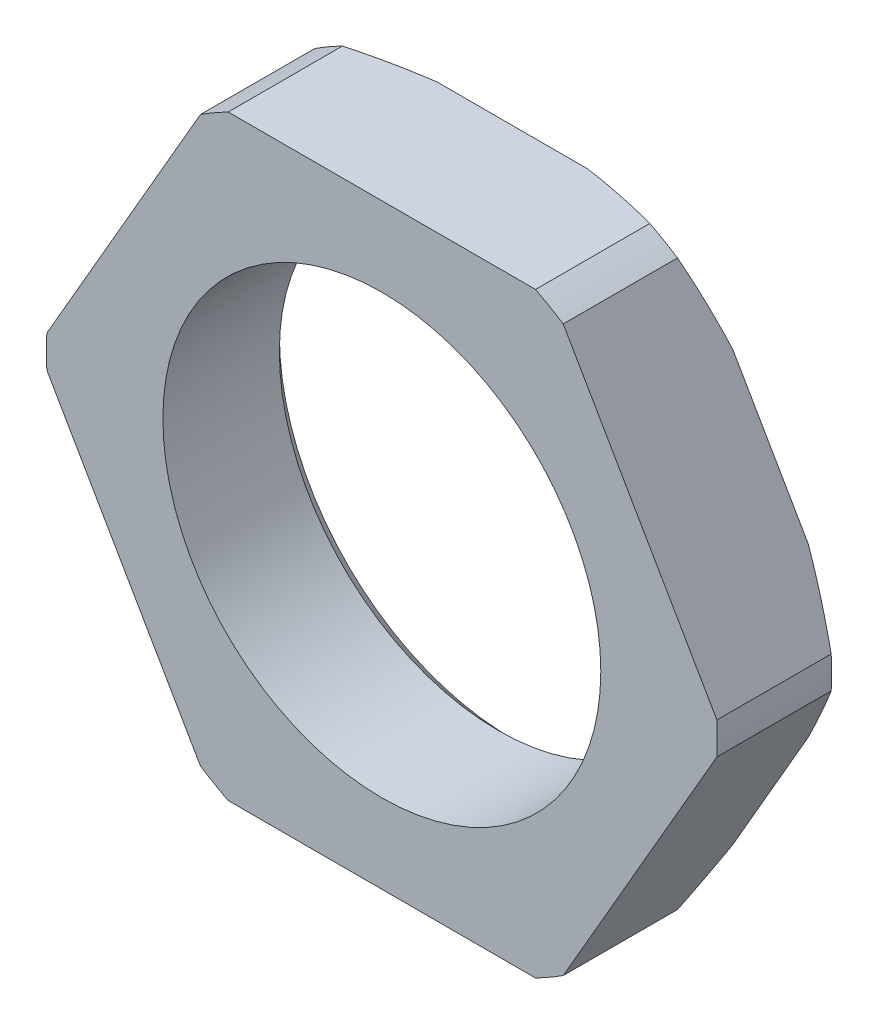
ISO-10303-21;
HEADER;
FILE_DESCRIPTION(('STEP AP214'),'2;1');
FILE_NAME('part.step','',(''),(''),'','','');
FILE_SCHEMA(('AUTOMOTIVE_DESIGN { 1 0 10303 214 1 1 1 1 }'));
ENDSEC;
DATA;
#1=APPLICATION_CONTEXT('core data for automotive mechanical design processes');
#2=APPLICATION_PROTOCOL_DEFINITION('international standard','automotive_design',2000,#1);
#3=PRODUCT_CONTEXT('',#1,'mechanical');
#4=PRODUCT('Part','Part','',(#3));
#5=PRODUCT_RELATED_PRODUCT_CATEGORY('part','',(#4));
#6=PRODUCT_DEFINITION_FORMATION('','',#4);
#7=PRODUCT_DEFINITION_CONTEXT('part definition',#1,'design');
#8=PRODUCT_DEFINITION('design','',#6,#7);
#9=PRODUCT_DEFINITION_SHAPE('','',#8);
#10=(LENGTH_UNIT() NAMED_UNIT(*) SI_UNIT(.MILLI.,.METRE.));
#11=(NAMED_UNIT(*) PLANE_ANGLE_UNIT() SI_UNIT($,.RADIAN.));
#12=(NAMED_UNIT(*) SI_UNIT($,.STERADIAN.) SOLID_ANGLE_UNIT());
#13=UNCERTAINTY_MEASURE_WITH_UNIT(LENGTH_MEASURE(1.E-05),#10,'distance_accuracy_value','');
#14=(GEOMETRIC_REPRESENTATION_CONTEXT(3) GLOBAL_UNCERTAINTY_ASSIGNED_CONTEXT((#13)) GLOBAL_UNIT_ASSIGNED_CONTEXT((#10,
#11,#12)) REPRESENTATION_CONTEXT('',''));
#15=CARTESIAN_POINT('',(0.,0.,0.));
#16=DIRECTION('',(0.,0.,1.));
#17=DIRECTION('',(1.,0.,0.));
#18=AXIS2_PLACEMENT_3D('',#15,#16,#17);
#19=CARTESIAN_POINT('',(0.,0.,-14.6633589102944));
#20=DIRECTION('',(0.,0.,1.));
#21=DIRECTION('',(1.,0.,0.));
#22=AXIS2_PLACEMENT_3D('',#19,#20,#21);
#23=CONICAL_SURFACE('',#22,18.,1.0471975511966);
#24=CARTESIAN_POINT('',(-4.03112887414931,-16.,-15.5293843140788));
#25=CARTESIAN_POINT('',(-4.3866132941997,-16.,-15.4792566705536));
#26=CARTESIAN_POINT('',(-4.74120174997239,-16.,-15.4229891250638));
#27=CARTESIAN_POINT('',(-5.44808349155829,-16.,-15.2991529721685));
#28=CARTESIAN_POINT('',(-5.80037851979249,-16.,-15.2315943346179));
#29=CARTESIAN_POINT('',(-6.50275542385974,-16.,-15.0860716925836));
#30=CARTESIAN_POINT('',(-6.85283754660872,-16.,-15.0081088712569));
#31=CARTESIAN_POINT('',(-7.55106969836229,-16.,-14.8426449075461));
#32=CARTESIAN_POINT('',(-7.89921775816723,-16.,-14.7551354397336));
#33=CARTESIAN_POINT('',(-8.24621125123532,-16.,-14.6633589102944));
#34=B_SPLINE_CURVE_WITH_KNOTS('',3,(#24,#25,#26,#27,#28,#29,#30,#31,#32,#33),.UNSPECIFIED.,.F.,
.F.,(4,2,2,2,4),(0.,1.07690776762645,2.15286961850029,3.22870921580364,4.30549464564187),.UNSPECIFIED.);
#35=CARTESIAN_POINT('',(-4.03112887414928,-16.,-15.5293843140788));
#36=VERTEX_POINT('',#35);
#37=CARTESIAN_POINT('',(-8.24621125123532,-16.,-14.6633589102944));
#38=VERTEX_POINT('',#37);
#39=EDGE_CURVE('E242',#36,#38,#34,.T.);
#40=ORIENTED_EDGE('',*,*,#39,.T.);
#41=CARTESIAN_POINT('',(0.,0.,-14.6633589102944));
#42=DIRECTION('',(0.,0.,-1.));
#43=DIRECTION('',(-1.,0.,0.));
#44=AXIS2_PLACEMENT_3D('',#41,#42,#43);
#45=CIRCLE('',#44,18.);
#46=CARTESIAN_POINT('',(-9.73330083493334,-15.1414284285429,-14.6633589102944));
#47=VERTEX_POINT('',#46);
#48=EDGE_CURVE('E280',#47,#38,#45,.F.);
#49=ORIENTED_EDGE('',*,*,#48,.F.);
#50=CARTESIAN_POINT('',(-9.73330083493334,-15.1414284285429,-14.6633589102944));
#51=CARTESIAN_POINT('',(-9.90679758146739,-14.840923248598,-14.7551354397336));
#52=CARTESIAN_POINT('',(-10.0808716113699,-14.5394181845286,-14.8426449075461));
#53=CARTESIAN_POINT('',(-10.4299876872466,-13.934731403371,-15.0081088712569));
#54=CARTESIAN_POINT('',(-10.6050287486211,-13.6315513916596,-15.0860716925836));
#55=CARTESIAN_POINT('',(-10.9562172006548,-13.0232751497059,-15.2315943346179));
#56=CARTESIAN_POINT('',(-11.1323647147719,-12.7181787056281,-15.2991529721685));
#57=CARTESIAN_POINT('',(-11.4858055855648,-12.1060011599433,-15.4229891250638));
#58=CARTESIAN_POINT('',(-11.6630998134512,-11.7989185493555,-15.4792566705536));
#59=CARTESIAN_POINT('',(-11.8408420234764,-11.4910600109423,-15.5293843140788));
#60=B_SPLINE_CURVE_WITH_KNOTS('',3,(#50,#51,#52,#53,#54,#55,#56,#57,#58,#59),.UNSPECIFIED.,.F.,
.F.,(4,2,2,2,4),(0.,1.07678542983824,2.15262502714159,3.22858687801544,4.30549464564189),.UNSPECIFIED.);
#61=CARTESIAN_POINT('',(-11.8408420234764,-11.4910600109423,-15.5293843140788));
#62=VERTEX_POINT('',#61);
#63=EDGE_CURVE('E212',#47,#62,#60,.T.);
#64=ORIENTED_EDGE('',*,*,#63,.T.);
#65=CARTESIAN_POINT('',(0.,0.,-15.5293843140788));
#66=DIRECTION('',(0.,0.,1.));
#67=DIRECTION('',(1.,0.,0.));
#68=AXIS2_PLACEMENT_3D('',#65,#66,#67);
#69=CIRCLE('',#68,16.5);
#70=EDGE_CURVE('E349',#62,#36,#69,.T.);
#71=ORIENTED_EDGE('',*,*,#70,.T.);
#72=EDGE_LOOP('',(#40,#49,#64,#71));
#73=FACE_BOUND('',#72,.T.);
#74=ADVANCED_FACE('F16',(#73),#23,.T.);
#75=CARTESIAN_POINT('',(0.,0.,-15.5293843140788));
#76=DIRECTION('',(0.,0.,-1.));
#77=DIRECTION('',(-1.,0.,0.));
#78=AXIS2_PLACEMENT_3D('',#75,#76,#77);
#79=CYLINDRICAL_SURFACE('',#78,18.);
#80=CARTESIAN_POINT('',(0.,0.,-8.52938431407882));
#81=DIRECTION('',(0.,0.,-1.));
#82=DIRECTION('',(-1.,0.,0.));
#83=AXIS2_PLACEMENT_3D('',#80,#81,#82);
#84=CIRCLE('',#83,18.);
#85=CARTESIAN_POINT('',(-8.24621125123532,-16.,-8.52938431407882));
#86=VERTEX_POINT('',#85);
#87=CARTESIAN_POINT('',(-9.73330083493334,-15.1414284285429,-8.52938431407882));
#88=VERTEX_POINT('',#87);
#89=EDGE_CURVE('E20',#86,#88,#84,.T.);
#90=ORIENTED_EDGE('',*,*,#89,.T.);
#91=DIRECTION('',(0.,0.,1.));
#92=VECTOR('',#91,1.);
#93=CARTESIAN_POINT('',(-9.73330083493334,-15.1414284285429,-15.5293843140788));
#94=LINE('',#93,#92);
#95=EDGE_CURVE('E259',#88,#47,#94,.F.);
#96=ORIENTED_EDGE('',*,*,#95,.T.);
#97=ORIENTED_EDGE('',*,*,#48,.T.);
#98=DIRECTION('',(0.,0.,1.));
#99=VECTOR('',#98,1.);
#100=CARTESIAN_POINT('',(-8.24621125123532,-16.,-15.5293843140788));
#101=LINE('',#100,#99);
#102=EDGE_CURVE('E247',#38,#86,#101,.T.);
#103=ORIENTED_EDGE('',*,*,#102,.T.);
#104=EDGE_LOOP('',(#90,#96,#97,#103));
#105=FACE_BOUND('',#104,.T.);
#106=ADVANCED_FACE('F282',(#105),#79,.T.);
#107=CARTESIAN_POINT('',(0.,0.,-14.6633589102944));
#108=DIRECTION('',(0.,0.,1.));
#109=DIRECTION('',(1.,0.,0.));
#110=AXIS2_PLACEMENT_3D('',#107,#108,#109);
#111=CONICAL_SURFACE('',#110,18.,1.0471975511966);
#112=CARTESIAN_POINT('',(11.8408420234764,-11.4910600109423,-15.5293843140788));
#113=CARTESIAN_POINT('',(11.6630998134512,-11.7989185493555,-15.4792566705536));
#114=CARTESIAN_POINT('',(11.4858055855648,-12.1060011599433,-15.4229891250638));
#115=CARTESIAN_POINT('',(11.1323647147719,-12.7181787056281,-15.2991529721685));
#116=CARTESIAN_POINT('',(10.9562172006548,-13.0232751497059,-15.2315943346179));
#117=CARTESIAN_POINT('',(10.6050287486211,-13.6315513916596,-15.0860716925836));
#118=CARTESIAN_POINT('',(10.4299876872466,-13.934731403371,-15.0081088712569));
#119=CARTESIAN_POINT('',(10.0808716113699,-14.5394181845287,-14.8426449075461));
#120=CARTESIAN_POINT('',(9.90679758146739,-14.840923248598,-14.7551354397336));
#121=CARTESIAN_POINT('',(9.73330083493334,-15.1414284285429,-14.6633589102944));
#122=B_SPLINE_CURVE_WITH_KNOTS('',3,(#112,#113,#114,#115,#116,#117,#118,#119,#120,#121),
.UNSPECIFIED.,.F.,.F.,(4,2,2,2,4),(0.,1.07690776762645,2.15286961850029,3.22870921580365,
4.30549464564188),.UNSPECIFIED.);
#123=CARTESIAN_POINT('',(11.8408420234764,-11.4910600109423,-15.5293843140788));
#124=VERTEX_POINT('',#123);
#125=CARTESIAN_POINT('',(9.73330083493334,-15.1414284285429,-14.6633589102944));
#126=VERTEX_POINT('',#125);
#127=EDGE_CURVE('E328',#124,#126,#122,.T.);
#128=ORIENTED_EDGE('',*,*,#127,.T.);
#129=CARTESIAN_POINT('',(0.,0.,-14.6633589102944));
#130=DIRECTION('',(0.,0.,-1.));
#131=DIRECTION('',(-1.,0.,0.));
#132=AXIS2_PLACEMENT_3D('',#129,#130,#131);
#133=CIRCLE('',#132,18.);
#134=CARTESIAN_POINT('',(8.24621125123532,-16.,-14.6633589102944));
#135=VERTEX_POINT('',#134);
#136=EDGE_CURVE('E278',#135,#126,#133,.F.);
#137=ORIENTED_EDGE('',*,*,#136,.F.);
#138=CARTESIAN_POINT('',(8.24621125123532,-16.,-14.6633589102944));
#139=CARTESIAN_POINT('',(7.89921775816722,-16.,-14.7551354397336));
#140=CARTESIAN_POINT('',(7.55106969836229,-16.,-14.8426449075461));
#141=CARTESIAN_POINT('',(6.85283754660871,-16.,-15.0081088712569));
#142=CARTESIAN_POINT('',(6.50275542385972,-16.,-15.0860716925836));
#143=CARTESIAN_POINT('',(5.80037851979247,-16.,-15.2315943346179));
#144=CARTESIAN_POINT('',(5.44808349155826,-16.,-15.2991529721685));
#145=CARTESIAN_POINT('',(4.74120174997236,-16.,-15.4229891250638));
#146=CARTESIAN_POINT('',(4.38661329419967,-16.,-15.4792566705536));
#147=CARTESIAN_POINT('',(4.03112887414928,-16.,-15.5293843140788));
#148=B_SPLINE_CURVE_WITH_KNOTS('',3,(#138,#139,#140,#141,#142,#143,#144,#145,#146,#147),
.UNSPECIFIED.,.F.,.F.,(4,2,2,2,4),(0.,1.07678542983824,2.1526250271416,3.22858687801545,
4.3054946456419),.UNSPECIFIED.);
#149=CARTESIAN_POINT('',(4.03112887414928,-16.,-15.5293843140788));
#150=VERTEX_POINT('',#149);
#151=EDGE_CURVE('E235',#135,#150,#148,.T.);
#152=ORIENTED_EDGE('',*,*,#151,.T.);
#153=CARTESIAN_POINT('',(0.,0.,-15.5293843140788));
#154=DIRECTION('',(0.,0.,1.));
#155=DIRECTION('',(1.,0.,0.));
#156=AXIS2_PLACEMENT_3D('',#153,#154,#155);
#157=CIRCLE('',#156,16.5);
#158=EDGE_CURVE('E335',#150,#124,#157,.T.);
#159=ORIENTED_EDGE('',*,*,#158,.T.);
#160=EDGE_LOOP('',(#128,#137,#152,#159));
#161=FACE_BOUND('',#160,.T.);
#162=ADVANCED_FACE('F334',(#161),#111,.T.);
#163=CARTESIAN_POINT('',(0.,0.,-15.5293843140788));
#164=DIRECTION('',(0.,0.,-1.));
#165=DIRECTION('',(-1.,0.,0.));
#166=AXIS2_PLACEMENT_3D('',#163,#164,#165);
#167=CYLINDRICAL_SURFACE('',#166,18.);
#168=CARTESIAN_POINT('',(0.,0.,-8.52938431407882));
#169=DIRECTION('',(0.,0.,-1.));
#170=DIRECTION('',(-1.,0.,0.));
#171=AXIS2_PLACEMENT_3D('',#168,#169,#170);
#172=CIRCLE('',#171,18.);
#173=CARTESIAN_POINT('',(9.73330083493334,-15.1414284285429,-8.52938431407882));
#174=VERTEX_POINT('',#173);
#175=CARTESIAN_POINT('',(8.24621125123532,-16.,-8.52938431407882));
#176=VERTEX_POINT('',#175);
#177=EDGE_CURVE('E277',#174,#176,#172,.T.);
#178=ORIENTED_EDGE('',*,*,#177,.T.);
#179=DIRECTION('',(0.,0.,1.));
#180=VECTOR('',#179,1.);
#181=CARTESIAN_POINT('',(8.24621125123532,-16.,-15.5293843140788));
#182=LINE('',#181,#180);
#183=EDGE_CURVE('E252',#176,#135,#182,.F.);
#184=ORIENTED_EDGE('',*,*,#183,.T.);
#185=ORIENTED_EDGE('',*,*,#136,.T.);
#186=DIRECTION('',(0.,0.,1.));
#187=VECTOR('',#186,1.);
#188=CARTESIAN_POINT('',(9.73330083493334,-15.1414284285429,-15.5293843140788));
#189=LINE('',#188,#187);
#190=EDGE_CURVE('E325',#126,#174,#189,.T.);
#191=ORIENTED_EDGE('',*,*,#190,.T.);
#192=EDGE_LOOP('',(#178,#184,#185,#191));
#193=FACE_BOUND('',#192,.T.);
#194=ADVANCED_FACE('F338',(#193),#167,.T.);
#195=CARTESIAN_POINT('',(0.,0.,-14.6633589102944));
#196=DIRECTION('',(0.,0.,1.));
#197=DIRECTION('',(0.,-1.,0.));
#198=AXIS2_PLACEMENT_3D('',#195,#196,#197);
#199=CONICAL_SURFACE('',#198,18.,1.0471975511966);
#200=CARTESIAN_POINT('',(0.,0.,-14.6633589102944));
#201=DIRECTION('',(0.,0.,-1.));
#202=DIRECTION('',(-1.,0.,0.));
#203=AXIS2_PLACEMENT_3D('',#200,#201,#202);
#204=CIRCLE('',#203,18.);
#205=CARTESIAN_POINT('',(17.9795120861687,-0.858571571457141,-14.6633589102944));
#206=VERTEX_POINT('',#205);
#207=CARTESIAN_POINT('',(17.9795120861687,0.858571571457141,-14.6633589102944));
#208=VERTEX_POINT('',#207);
#209=EDGE_CURVE('E274',#206,#208,#204,.F.);
#210=ORIENTED_EDGE('',*,*,#209,.F.);
#211=CARTESIAN_POINT('',(17.9795120861687,-0.858571571457141,-14.6633589102944));
#212=CARTESIAN_POINT('',(17.8060153396346,-1.15907675140201,-14.7551354397336));
#213=CARTESIAN_POINT('',(17.6319413097322,-1.46058181547135,-14.8426449075461));
#214=CARTESIAN_POINT('',(17.2828252338554,-2.06526859662901,-15.0081088712569));
#215=CARTESIAN_POINT('',(17.1077841724809,-2.36844860834042,-15.0860716925836));
#216=CARTESIAN_POINT('',(16.7565957204473,-2.97672485029412,-15.2315943346179));
#217=CARTESIAN_POINT('',(16.5804482063302,-3.2818212943719,-15.2991529721685));
#218=CARTESIAN_POINT('',(16.2270073355372,-3.89399884005668,-15.4229891250638));
#219=CARTESIAN_POINT('',(16.0497131076509,-4.20108145064453,-15.4792566705536));
#220=CARTESIAN_POINT('',(15.8719708976257,-4.50893998905774,-15.5293843140788));
#221=B_SPLINE_CURVE_WITH_KNOTS('',3,(#211,#212,#213,#214,#215,#216,#217,#218,#219,#220),
.UNSPECIFIED.,.F.,.F.,(4,2,2,2,4),(0.,1.07678542983824,2.1526250271416,3.22858687801544,
4.3054946456419),.UNSPECIFIED.);
#222=CARTESIAN_POINT('',(15.8719708976257,-4.50893998905774,-15.5293843140788));
#223=VERTEX_POINT('',#222);
#224=EDGE_CURVE('E321',#206,#223,#221,.T.);
#225=ORIENTED_EDGE('',*,*,#224,.T.);
#226=CARTESIAN_POINT('',(0.,0.,-15.5293843140788));
#227=DIRECTION('',(0.,0.,1.));
#228=DIRECTION('',(0.,-1.,0.));
#229=AXIS2_PLACEMENT_3D('',#226,#227,#228);
#230=CIRCLE('',#229,16.5);
#231=CARTESIAN_POINT('',(15.8719708976257,4.50893998905774,-15.5293843140788));
#232=VERTEX_POINT('',#231);
#233=EDGE_CURVE('E352',#223,#232,#230,.T.);
#234=ORIENTED_EDGE('',*,*,#233,.T.);
#235=CARTESIAN_POINT('',(15.8719708976257,4.50893998905774,-15.5293843140788));
#236=CARTESIAN_POINT('',(16.0497131076509,4.20108145064453,-15.4792566705536));
#237=CARTESIAN_POINT('',(16.2270073355372,3.89399884005668,-15.4229891250638));
#238=CARTESIAN_POINT('',(16.5804482063302,3.2818212943719,-15.2991529721685));
#239=CARTESIAN_POINT('',(16.7565957204473,2.97672485029412,-15.2315943346179));
#240=CARTESIAN_POINT('',(17.1077841724809,2.36844860834042,-15.0860716925836));
#241=CARTESIAN_POINT('',(17.2828252338554,2.06526859662901,-15.0081088712569));
#242=CARTESIAN_POINT('',(17.6319413097322,1.46058181547135,-14.8426449075461));
#243=CARTESIAN_POINT('',(17.8060153396346,1.15907675140201,-14.7551354397336));
#244=CARTESIAN_POINT('',(17.9795120861687,0.858571571457141,-14.6633589102944));
#245=B_SPLINE_CURVE_WITH_KNOTS('',3,(#235,#236,#237,#238,#239,#240,#241,#242,#243,#244),
.UNSPECIFIED.,.F.,.F.,(4,2,2,2,4),(0.,1.07690776762646,2.1528696185003,3.22870921580365,
4.3054946456419),.UNSPECIFIED.);
#246=EDGE_CURVE('E317',#232,#208,#245,.T.);
#247=ORIENTED_EDGE('',*,*,#246,.T.);
#248=EDGE_LOOP('',(#210,#225,#234,#247));
#249=FACE_BOUND('',#248,.T.);
#250=ADVANCED_FACE('F561',(#249),#199,.T.);
#251=CARTESIAN_POINT('',(0.,0.,-15.5293843140788));
#252=DIRECTION('',(0.,0.,-1.));
#253=DIRECTION('',(-1.,0.,0.));
#254=AXIS2_PLACEMENT_3D('',#251,#252,#253);
#255=CYLINDRICAL_SURFACE('',#254,18.);
#256=CARTESIAN_POINT('',(0.,0.,-8.52938431407882));
#257=DIRECTION('',(0.,0.,-1.));
#258=DIRECTION('',(-1.,0.,0.));
#259=AXIS2_PLACEMENT_3D('',#256,#257,#258);
#260=CIRCLE('',#259,18.);
#261=CARTESIAN_POINT('',(17.9795120861687,0.858571571457141,-8.52938431407882));
#262=VERTEX_POINT('',#261);
#263=CARTESIAN_POINT('',(17.9795120861687,-0.858571571457141,-8.52938431407882));
#264=VERTEX_POINT('',#263);
#265=EDGE_CURVE('E273',#262,#264,#260,.T.);
#266=ORIENTED_EDGE('',*,*,#265,.T.);
#267=DIRECTION('',(0.,0.,1.));
#268=VECTOR('',#267,1.);
#269=CARTESIAN_POINT('',(17.9795120861687,-0.858571571457141,-15.5293843140788));
#270=LINE('',#269,#268);
#271=EDGE_CURVE('E322',#264,#206,#270,.F.);
#272=ORIENTED_EDGE('',*,*,#271,.T.);
#273=ORIENTED_EDGE('',*,*,#209,.T.);
#274=DIRECTION('',(0.,0.,1.));
#275=VECTOR('',#274,1.);
#276=CARTESIAN_POINT('',(17.9795120861687,0.858571571457141,-15.5293843140788));
#277=LINE('',#276,#275);
#278=EDGE_CURVE('E314',#208,#262,#277,.T.);
#279=ORIENTED_EDGE('',*,*,#278,.T.);
#280=EDGE_LOOP('',(#266,#272,#273,#279));
#281=FACE_BOUND('',#280,.T.);
#282=ADVANCED_FACE('F550',(#281),#255,.T.);
#283=CARTESIAN_POINT('',(0.,0.,-14.6633589102944));
#284=DIRECTION('',(0.,0.,1.));
#285=DIRECTION('',(1.,0.,0.));
#286=AXIS2_PLACEMENT_3D('',#283,#284,#285);
#287=CONICAL_SURFACE('',#286,18.,1.0471975511966);
#288=CARTESIAN_POINT('',(9.73330083493334,15.1414284285429,-14.6633589102944));
#289=CARTESIAN_POINT('',(9.90679758146739,14.840923248598,-14.7551354397336));
#290=CARTESIAN_POINT('',(10.0808716113699,14.5394181845287,-14.8426449075461));
#291=CARTESIAN_POINT('',(10.4299876872466,13.934731403371,-15.0081088712569));
#292=CARTESIAN_POINT('',(10.6050287486211,13.6315513916596,-15.0860716925836));
#293=CARTESIAN_POINT('',(10.9562172006548,13.0232751497059,-15.2315943346179));
#294=CARTESIAN_POINT('',(11.1323647147719,12.7181787056281,-15.2991529721685));
#295=CARTESIAN_POINT('',(11.4858055855648,12.1060011599433,-15.4229891250638));
#296=CARTESIAN_POINT('',(11.6630998134512,11.7989185493555,-15.4792566705536));
#297=CARTESIAN_POINT('',(11.8408420234764,11.4910600109423,-15.5293843140788));
#298=B_SPLINE_CURVE_WITH_KNOTS('',3,(#288,#289,#290,#291,#292,#293,#294,#295,#296,#297),
.UNSPECIFIED.,.F.,.F.,(4,2,2,2,4),(0.,1.07678542983824,2.15262502714159,3.22858687801543,
4.30549464564189),.UNSPECIFIED.);
#299=CARTESIAN_POINT('',(9.73330083493334,15.1414284285429,-14.6633589102944));
#300=VERTEX_POINT('',#299);
#301=CARTESIAN_POINT('',(11.8408420234764,11.4910600109423,-15.5293843140788));
#302=VERTEX_POINT('',#301);
#303=EDGE_CURVE('E310',#300,#302,#298,.T.);
#304=ORIENTED_EDGE('',*,*,#303,.T.);
#305=CARTESIAN_POINT('',(0.,0.,-15.5293843140788));
#306=DIRECTION('',(0.,0.,1.));
#307=DIRECTION('',(1.,0.,0.));
#308=AXIS2_PLACEMENT_3D('',#305,#306,#307);
#309=CIRCLE('',#308,16.5);
#310=CARTESIAN_POINT('',(4.03112887414928,16.,-15.5293843140788));
#311=VERTEX_POINT('',#310);
#312=EDGE_CURVE('E354',#302,#311,#309,.T.);
#313=ORIENTED_EDGE('',*,*,#312,.T.);
#314=CARTESIAN_POINT('',(4.03112887414928,16.,-15.5293843140788));
#315=CARTESIAN_POINT('',(4.38661329419967,16.,-15.4792566705536));
#316=CARTESIAN_POINT('',(4.74120174997236,16.,-15.4229891250638));
#317=CARTESIAN_POINT('',(5.44808349155826,16.,-15.2991529721685));
#318=CARTESIAN_POINT('',(5.80037851979247,16.,-15.2315943346179));
#319=CARTESIAN_POINT('',(6.50275542385972,16.,-15.0860716925836));
#320=CARTESIAN_POINT('',(6.85283754660871,16.,-15.0081088712569));
#321=CARTESIAN_POINT('',(7.55106969836229,16.,-14.8426449075461));
#322=CARTESIAN_POINT('',(7.89921775816722,16.,-14.7551354397336));
#323=CARTESIAN_POINT('',(8.24621125123532,16.,-14.6633589102944));
#324=B_SPLINE_CURVE_WITH_KNOTS('',3,(#314,#315,#316,#317,#318,#319,#320,#321,#322,#323),
.UNSPECIFIED.,.F.,.F.,(4,2,2,2,4),(0.,1.07690776762646,2.1528696185003,3.22870921580366,
4.3054946456419),.UNSPECIFIED.);
#325=CARTESIAN_POINT('',(8.24621125123532,16.,-14.6633589102944));
#326=VERTEX_POINT('',#325);
#327=EDGE_CURVE('E306',#311,#326,#324,.T.);
#328=ORIENTED_EDGE('',*,*,#327,.T.);
#329=CARTESIAN_POINT('',(0.,0.,-14.6633589102944));
#330=DIRECTION('',(0.,0.,-1.));
#331=DIRECTION('',(-1.,0.,0.));
#332=AXIS2_PLACEMENT_3D('',#329,#330,#331);
#333=CIRCLE('',#332,18.);
#334=EDGE_CURVE('E269',#300,#326,#333,.F.);
#335=ORIENTED_EDGE('',*,*,#334,.F.);
#336=EDGE_LOOP('',(#304,#313,#328,#335));
#337=FACE_BOUND('',#336,.T.);
#338=ADVANCED_FACE('F376',(#337),#287,.T.);
#339=CARTESIAN_POINT('',(0.,0.,-15.5293843140788));
#340=DIRECTION('',(0.,0.,-1.));
#341=DIRECTION('',(-1.,0.,0.));
#342=AXIS2_PLACEMENT_3D('',#339,#340,#341);
#343=CYLINDRICAL_SURFACE('',#342,18.);
#344=CARTESIAN_POINT('',(0.,0.,-8.52938431407882));
#345=DIRECTION('',(0.,0.,-1.));
#346=DIRECTION('',(-1.,0.,0.));
#347=AXIS2_PLACEMENT_3D('',#344,#345,#346);
#348=CIRCLE('',#347,18.);
#349=CARTESIAN_POINT('',(8.24621125123532,16.,-8.52938431407882));
#350=VERTEX_POINT('',#349);
#351=CARTESIAN_POINT('',(9.73330083493334,15.1414284285429,-8.52938431407882));
#352=VERTEX_POINT('',#351);
#353=EDGE_CURVE('E272',#350,#352,#348,.T.);
#354=ORIENTED_EDGE('',*,*,#353,.T.);
#355=DIRECTION('',(0.,0.,1.));
#356=VECTOR('',#355,1.);
#357=CARTESIAN_POINT('',(9.73330083493334,15.1414284285429,-15.5293843140788));
#358=LINE('',#357,#356);
#359=EDGE_CURVE('E311',#352,#300,#358,.F.);
#360=ORIENTED_EDGE('',*,*,#359,.T.);
#361=ORIENTED_EDGE('',*,*,#334,.T.);
#362=DIRECTION('',(0.,0.,-1.));
#363=VECTOR('',#362,1.);
#364=CARTESIAN_POINT('',(8.24621125123532,16.,-15.5293843140788));
#365=LINE('',#364,#363);
#366=EDGE_CURVE('E303',#326,#350,#365,.F.);
#367=ORIENTED_EDGE('',*,*,#366,.T.);
#368=EDGE_LOOP('',(#354,#360,#361,#367));
#369=FACE_BOUND('',#368,.T.);
#370=ADVANCED_FACE('F366',(#369),#343,.T.);
#371=CARTESIAN_POINT('',(0.,0.,-15.5293843140788));
#372=DIRECTION('',(0.,0.,1.));
#373=DIRECTION('',(1.,0.,0.));
#374=AXIS2_PLACEMENT_3D('',#371,#372,#373);
#375=PLANE('',#374);
#376=CARTESIAN_POINT('',(0.,0.,-15.5293843140788));
#377=DIRECTION('',(0.,0.,-1.));
#378=DIRECTION('',(-1.,0.,0.));
#379=AXIS2_PLACEMENT_3D('',#376,#377,#378);
#380=CIRCLE('',#379,12.5);
#381=CARTESIAN_POINT('',(-12.5,0.,-15.5293843140788));
#382=VERTEX_POINT('',#381);
#383=EDGE_CURVE('E166',#382,#382,#380,.F.);
#384=ORIENTED_EDGE('',*,*,#383,.T.);
#385=EDGE_LOOP('',(#384));
#386=FACE_BOUND('',#385,.T.);
#387=DIRECTION('',(0.500000000000001,-0.866025403784438,0.));
#388=VECTOR('',#387,1.);
#389=CARTESIAN_POINT('',(9.73330083493334,15.1414284285429,-15.5293843140788));
#390=LINE('',#389,#388);
#391=EDGE_CURVE('E318',#302,#232,#390,.T.);
#392=ORIENTED_EDGE('',*,*,#391,.T.);
#393=ORIENTED_EDGE('',*,*,#233,.F.);
#394=DIRECTION('',(-0.500000000000001,-0.866025403784438,0.));
#395=VECTOR('',#394,1.);
#396=CARTESIAN_POINT('',(9.73330083493334,-15.1414284285429,-15.5293843140788));
#397=LINE('',#396,#395);
#398=EDGE_CURVE('E329',#223,#124,#397,.T.);
#399=ORIENTED_EDGE('',*,*,#398,.T.);
#400=ORIENTED_EDGE('',*,*,#158,.F.);
#401=DIRECTION('',(1.,0.,0.));
#402=VECTOR('',#401,1.);
#403=CARTESIAN_POINT('',(-8.24621125123532,-16.,-15.5293843140788));
#404=LINE('',#403,#402);
#405=EDGE_CURVE('E248',#150,#36,#404,.F.);
#406=ORIENTED_EDGE('',*,*,#405,.T.);
#407=ORIENTED_EDGE('',*,*,#70,.F.);
#408=DIRECTION('',(-0.500000000000001,0.866025403784438,0.));
#409=VECTOR('',#408,1.);
#410=CARTESIAN_POINT('',(-9.73330083493334,-15.1414284285429,-15.5293843140788));
#411=LINE('',#410,#409);
#412=CARTESIAN_POINT('',(-15.8719708976257,-4.50893998905773,-15.5293843140788));
#413=VERTEX_POINT('',#412);
#414=EDGE_CURVE('E211',#62,#413,#411,.T.);
#415=ORIENTED_EDGE('',*,*,#414,.T.);
#416=CARTESIAN_POINT('',(0.,0.,-15.5293843140788));
#417=DIRECTION('',(0.,0.,1.));
#418=DIRECTION('',(0.,-1.,0.));
#419=AXIS2_PLACEMENT_3D('',#416,#417,#418);
#420=CIRCLE('',#419,16.5);
#421=CARTESIAN_POINT('',(-15.8719708976257,4.50893998905774,-15.5293843140788));
#422=VERTEX_POINT('',#421);
#423=EDGE_CURVE('E167',#422,#413,#420,.T.);
#424=ORIENTED_EDGE('',*,*,#423,.F.);
#425=DIRECTION('',(0.500000000000001,0.866025403784438,0.));
#426=VECTOR('',#425,1.);
#427=CARTESIAN_POINT('',(-9.73330083493334,15.1414284285429,-15.5293843140788));
#428=LINE('',#427,#426);
#429=CARTESIAN_POINT('',(-11.8408420234764,11.4910600109423,-15.5293843140788));
#430=VERTEX_POINT('',#429);
#431=EDGE_CURVE('E171',#422,#430,#428,.T.);
#432=ORIENTED_EDGE('',*,*,#431,.T.);
#433=CARTESIAN_POINT('',(0.,0.,-15.5293843140788));
#434=DIRECTION('',(0.,0.,1.));
#435=DIRECTION('',(1.,0.,0.));
#436=AXIS2_PLACEMENT_3D('',#433,#434,#435);
#437=CIRCLE('',#436,16.5);
#438=CARTESIAN_POINT('',(-4.03112887414928,16.,-15.5293843140788));
#439=VERTEX_POINT('',#438);
#440=EDGE_CURVE('E268',#439,#430,#437,.T.);
#441=ORIENTED_EDGE('',*,*,#440,.F.);
#442=DIRECTION('',(1.,0.,0.));
#443=VECTOR('',#442,1.);
#444=CARTESIAN_POINT('',(-8.24621125123532,16.,-15.5293843140788));
#445=LINE('',#444,#443);
#446=EDGE_CURVE('E307',#439,#311,#445,.T.);
#447=ORIENTED_EDGE('',*,*,#446,.T.);
#448=ORIENTED_EDGE('',*,*,#312,.F.);
#449=EDGE_LOOP('',(#392,#393,#399,#400,#406,#407,#415,#424,#432,#441,#447,#448));
#450=FACE_BOUND('',#449,.T.);
#451=ADVANCED_FACE('F361',(#386,#450),#375,.F.);
#452=CARTESIAN_POINT('',(0.,0.,-14.6633589102944));
#453=DIRECTION('',(0.,0.,1.));
#454=DIRECTION('',(1.,0.,0.));
#455=AXIS2_PLACEMENT_3D('',#452,#453,#454);
#456=CONICAL_SURFACE('',#455,18.,1.0471975511966);
#457=CARTESIAN_POINT('',(-8.24621125123532,16.,-14.6633589102944));
#458=CARTESIAN_POINT('',(-7.89921775816722,16.,-14.7551354397336));
#459=CARTESIAN_POINT('',(-7.55106969836229,16.,-14.8426449075461));
#460=CARTESIAN_POINT('',(-6.85283754660871,16.,-15.0081088712569));
#461=CARTESIAN_POINT('',(-6.50275542385972,16.,-15.0860716925836));
#462=CARTESIAN_POINT('',(-5.80037851979247,16.,-15.2315943346179));
#463=CARTESIAN_POINT('',(-5.44808349155826,16.,-15.2991529721685));
#464=CARTESIAN_POINT('',(-4.74120174997236,16.,-15.4229891250638));
#465=CARTESIAN_POINT('',(-4.38661329419967,16.,-15.4792566705536));
#466=CARTESIAN_POINT('',(-4.03112887414928,16.,-15.5293843140788));
#467=B_SPLINE_CURVE_WITH_KNOTS('',3,(#457,#458,#459,#460,#461,#462,#463,#464,#465,#466),
.UNSPECIFIED.,.F.,.F.,(4,2,2,2,4),(0.,1.07678542983824,2.1526250271416,3.22858687801545,
4.3054946456419),.UNSPECIFIED.);
#468=CARTESIAN_POINT('',(-8.24621125123532,16.,-14.6633589102944));
#469=VERTEX_POINT('',#468);
#470=EDGE_CURVE('E299',#469,#439,#467,.T.);
#471=ORIENTED_EDGE('',*,*,#470,.T.);
#472=ORIENTED_EDGE('',*,*,#440,.T.);
#473=CARTESIAN_POINT('',(-11.8408420234764,11.4910600109423,-15.5293843140788));
#474=CARTESIAN_POINT('',(-11.6630998134512,11.7989185493555,-15.4792566705536));
#475=CARTESIAN_POINT('',(-11.4858055855648,12.1060011599433,-15.4229891250638));
#476=CARTESIAN_POINT('',(-11.1323647147719,12.7181787056281,-15.2991529721685));
#477=CARTESIAN_POINT('',(-10.9562172006548,13.0232751497059,-15.2315943346179));
#478=CARTESIAN_POINT('',(-10.6050287486211,13.6315513916596,-15.0860716925836));
#479=CARTESIAN_POINT('',(-10.4299876872466,13.934731403371,-15.0081088712569));
#480=CARTESIAN_POINT('',(-10.0808716113699,14.5394181845287,-14.8426449075461));
#481=CARTESIAN_POINT('',(-9.90679758146739,14.840923248598,-14.7551354397336));
#482=CARTESIAN_POINT('',(-9.73330083493334,15.1414284285429,-14.6633589102944));
#483=B_SPLINE_CURVE_WITH_KNOTS('',3,(#473,#474,#475,#476,#477,#478,#479,#480,#481,#482),
.UNSPECIFIED.,.F.,.F.,(4,2,2,2,4),(0.,1.07690776762645,2.1528696185003,3.22870921580365,
4.30549464564189),.UNSPECIFIED.);
#484=CARTESIAN_POINT('',(-9.73330083493334,15.1414284285429,-14.6633589102944));
#485=VERTEX_POINT('',#484);
#486=EDGE_CURVE('E185',#430,#485,#483,.T.);
#487=ORIENTED_EDGE('',*,*,#486,.T.);
#488=CARTESIAN_POINT('',(0.,0.,-14.6633589102944));
#489=DIRECTION('',(0.,0.,-1.));
#490=DIRECTION('',(-1.,0.,0.));
#491=AXIS2_PLACEMENT_3D('',#488,#489,#490);
#492=CIRCLE('',#491,18.);
#493=EDGE_CURVE('E265',#469,#485,#492,.F.);
#494=ORIENTED_EDGE('',*,*,#493,.F.);
#495=EDGE_LOOP('',(#471,#472,#487,#494));
#496=FACE_BOUND('',#495,.T.);
#497=ADVANCED_FACE('F365',(#496),#456,.T.);
#498=CARTESIAN_POINT('',(0.,0.,-15.5293843140788));
#499=DIRECTION('',(0.,0.,-1.));
#500=DIRECTION('',(-1.,0.,0.));
#501=AXIS2_PLACEMENT_3D('',#498,#499,#500);
#502=CYLINDRICAL_SURFACE('',#501,18.);
#503=CARTESIAN_POINT('',(0.,0.,-8.52938431407882));
#504=DIRECTION('',(0.,0.,-1.));
#505=DIRECTION('',(-1.,0.,0.));
#506=AXIS2_PLACEMENT_3D('',#503,#504,#505);
#507=CIRCLE('',#506,18.);
#508=CARTESIAN_POINT('',(-9.73330083493334,15.1414284285429,-8.52938431407882));
#509=VERTEX_POINT('',#508);
#510=CARTESIAN_POINT('',(-8.24621125123532,16.,-8.52938431407882));
#511=VERTEX_POINT('',#510);
#512=EDGE_CURVE('E35',#509,#511,#507,.T.);
#513=ORIENTED_EDGE('',*,*,#512,.T.);
#514=DIRECTION('',(0.,0.,-1.));
#515=VECTOR('',#514,1.);
#516=CARTESIAN_POINT('',(-8.24621125123532,16.,-15.5293843140788));
#517=LINE('',#516,#515);
#518=EDGE_CURVE('E300',#511,#469,#517,.T.);
#519=ORIENTED_EDGE('',*,*,#518,.T.);
#520=ORIENTED_EDGE('',*,*,#493,.T.);
#521=DIRECTION('',(0.,0.,1.));
#522=VECTOR('',#521,1.);
#523=CARTESIAN_POINT('',(-9.73330083493334,15.1414284285429,-15.5293843140788));
#524=LINE('',#523,#522);
#525=EDGE_CURVE('E156',#485,#509,#524,.T.);
#526=ORIENTED_EDGE('',*,*,#525,.T.);
#527=EDGE_LOOP('',(#513,#519,#520,#526));
#528=FACE_BOUND('',#527,.T.);
#529=ADVANCED_FACE('F374',(#528),#502,.T.);
#530=CARTESIAN_POINT('',(0.,0.,-15.5293843140788));
#531=DIRECTION('',(0.,0.,-1.));
#532=DIRECTION('',(-1.,0.,0.));
#533=AXIS2_PLACEMENT_3D('',#530,#531,#532);
#534=CYLINDRICAL_SURFACE('',#533,18.);
#535=CARTESIAN_POINT('',(0.,0.,-8.52938431407882));
#536=DIRECTION('',(0.,0.,-1.));
#537=DIRECTION('',(-1.,0.,0.));
#538=AXIS2_PLACEMENT_3D('',#535,#536,#537);
#539=CIRCLE('',#538,18.);
#540=CARTESIAN_POINT('',(-17.9795120861687,-0.858571571457141,-8.52938431407882));
#541=VERTEX_POINT('',#540);
#542=CARTESIAN_POINT('',(-17.9795120861687,0.858571571457141,-8.52938431407882));
#543=VERTEX_POINT('',#542);
#544=EDGE_CURVE('E112',#541,#543,#539,.T.);
#545=ORIENTED_EDGE('',*,*,#544,.T.);
#546=DIRECTION('',(0.,0.,1.));
#547=VECTOR('',#546,1.);
#548=CARTESIAN_POINT('',(-17.9795120861687,0.858571571457141,-15.5293843140788));
#549=LINE('',#548,#547);
#550=CARTESIAN_POINT('',(-17.9795120861687,0.858571571457141,-14.6633589102944));
#551=VERTEX_POINT('',#550);
#552=EDGE_CURVE('E147',#543,#551,#549,.F.);
#553=ORIENTED_EDGE('',*,*,#552,.T.);
#554=CARTESIAN_POINT('',(0.,0.,-14.6633589102944));
#555=DIRECTION('',(0.,0.,1.));
#556=DIRECTION('',(1.,0.,0.));
#557=AXIS2_PLACEMENT_3D('',#554,#555,#556);
#558=CIRCLE('',#557,18.);
#559=CARTESIAN_POINT('',(-17.9795120861687,-0.858571571457141,-14.6633589102944));
#560=VERTEX_POINT('',#559);
#561=EDGE_CURVE('E150',#560,#551,#558,.F.);
#562=ORIENTED_EDGE('',*,*,#561,.F.);
#563=DIRECTION('',(0.,0.,1.));
#564=VECTOR('',#563,1.);
#565=CARTESIAN_POINT('',(-17.9795120861687,-0.858571571457141,-15.5293843140788));
#566=LINE('',#565,#564);
#567=EDGE_CURVE('E210',#560,#541,#566,.T.);
#568=ORIENTED_EDGE('',*,*,#567,.T.);
#569=EDGE_LOOP('',(#545,#553,#562,#568));
#570=FACE_BOUND('',#569,.T.);
#571=ADVANCED_FACE('F149',(#570),#534,.T.);
#572=CARTESIAN_POINT('',(0.,0.,-14.6633589102944));
#573=DIRECTION('',(0.,0.,1.));
#574=DIRECTION('',(0.,-1.,0.));
#575=AXIS2_PLACEMENT_3D('',#572,#573,#574);
#576=CONICAL_SURFACE('',#575,18.,1.0471975511966);
#577=CARTESIAN_POINT('',(-15.8719708976257,-4.50893998905771,-15.5293843140788));
#578=CARTESIAN_POINT('',(-16.0497131076509,-4.2010814506445,-15.4792566705536));
#579=CARTESIAN_POINT('',(-16.2270073355372,-3.89399884005665,-15.4229891250638));
#580=CARTESIAN_POINT('',(-16.5804482063302,-3.28182129437188,-15.2991529721685));
#581=CARTESIAN_POINT('',(-16.7565957204473,-2.97672485029411,-15.2315943346179));
#582=CARTESIAN_POINT('',(-17.1077841724809,-2.36844860834041,-15.0860716925836));
#583=CARTESIAN_POINT('',(-17.2828252338554,-2.065268596629,-15.0081088712569));
#584=CARTESIAN_POINT('',(-17.6319413097322,-1.46058181547134,-14.8426449075461));
#585=CARTESIAN_POINT('',(-17.8060153396346,-1.15907675140201,-14.7551354397336));
#586=CARTESIAN_POINT('',(-17.9795120861687,-0.85857157145714,-14.6633589102944));
#587=B_SPLINE_CURVE_WITH_KNOTS('',3,(#577,#578,#579,#580,#581,#582,#583,#584,#585,#586),
.UNSPECIFIED.,.F.,.F.,(4,2,2,2,4),(0.,1.07690776762645,2.15286961850028,3.22870921580363,
4.30549464564186),.UNSPECIFIED.);
#588=EDGE_CURVE('E164',#413,#560,#587,.T.);
#589=ORIENTED_EDGE('',*,*,#588,.T.);
#590=ORIENTED_EDGE('',*,*,#561,.T.);
#591=CARTESIAN_POINT('',(-17.9795120861687,0.858571571457142,-14.6633589102944));
#592=CARTESIAN_POINT('',(-17.8060153396346,1.15907675140201,-14.7551354397336));
#593=CARTESIAN_POINT('',(-17.6319413097322,1.46058181547135,-14.8426449075461));
#594=CARTESIAN_POINT('',(-17.2828252338554,2.06526859662902,-15.0081088712569));
#595=CARTESIAN_POINT('',(-17.1077841724809,2.36844860834042,-15.0860716925836));
#596=CARTESIAN_POINT('',(-16.7565957204473,2.97672485029413,-15.2315943346179));
#597=CARTESIAN_POINT('',(-16.5804482063302,3.28182129437191,-15.2991529721685));
#598=CARTESIAN_POINT('',(-16.2270073355372,3.89399884005668,-15.4229891250638));
#599=CARTESIAN_POINT('',(-16.0497131076509,4.20108145064453,-15.4792566705536));
#600=CARTESIAN_POINT('',(-15.8719708976257,4.50893998905774,-15.5293843140788));
#601=B_SPLINE_CURVE_WITH_KNOTS('',3,(#591,#592,#593,#594,#595,#596,#597,#598,#599,#600),
.UNSPECIFIED.,.F.,.F.,(4,2,2,2,4),(0.,1.07678542983824,2.1526250271416,3.22858687801544,
4.3054946456419),.UNSPECIFIED.);
#602=EDGE_CURVE('E155',#551,#422,#601,.T.);
#603=ORIENTED_EDGE('',*,*,#602,.T.);
#604=ORIENTED_EDGE('',*,*,#423,.T.);
#605=EDGE_LOOP('',(#589,#590,#603,#604));
#606=FACE_BOUND('',#605,.T.);
#607=ADVANCED_FACE('F160',(#606),#576,.T.);
#608=CARTESIAN_POINT('',(0.,0.,-15.5293843140788));
#609=DIRECTION('',(0.,0.,-1.));
#610=DIRECTION('',(-1.,0.,0.));
#611=AXIS2_PLACEMENT_3D('',#608,#609,#610);
#612=CONICAL_SURFACE('',#611,12.5,0.785398163397453);
#613=CARTESIAN_POINT('',(0.,0.,-14.7793843140788));
#614=DIRECTION('',(0.,0.,-1.));
#615=DIRECTION('',(-1.,0.,0.));
#616=AXIS2_PLACEMENT_3D('',#613,#614,#615);
#617=CIRCLE('',#616,11.75);
#618=CARTESIAN_POINT('',(-11.75,0.,-14.7793843140788));
#619=VERTEX_POINT('',#618);
#620=EDGE_CURVE('E172',#619,#619,#617,.F.);
#621=ORIENTED_EDGE('',*,*,#620,.T.);
#622=EDGE_LOOP('',(#621));
#623=FACE_BOUND('',#622,.T.);
#624=ORIENTED_EDGE('',*,*,#383,.F.);
#625=EDGE_LOOP('',(#624));
#626=FACE_BOUND('',#625,.T.);
#627=ADVANCED_FACE('F199',(#623,#626),#612,.F.);
#628=CARTESIAN_POINT('',(-9.73330083493334,-15.1414284285429,-15.5293843140788));
#629=DIRECTION('',(0.866025403784438,0.500000000000001,0.));
#630=DIRECTION('',(-0.500000000000001,0.866025403784438,0.));
#631=AXIS2_PLACEMENT_3D('',#628,#629,#630);
#632=PLANE('',#631);
#633=ORIENTED_EDGE('',*,*,#95,.F.);
#634=DIRECTION('',(0.5,-0.866025403784438,0.));
#635=VECTOR('',#634,1.);
#636=CARTESIAN_POINT('',(-17.9795120861687,-0.858571571457141,-8.52938431407882));
#637=LINE('',#636,#635);
#638=EDGE_CURVE('E175',#541,#88,#637,.T.);
#639=ORIENTED_EDGE('',*,*,#638,.F.);
#640=ORIENTED_EDGE('',*,*,#567,.F.);
#641=ORIENTED_EDGE('',*,*,#588,.F.);
#642=ORIENTED_EDGE('',*,*,#414,.F.);
#643=ORIENTED_EDGE('',*,*,#63,.F.);
#644=EDGE_LOOP('',(#633,#639,#640,#641,#642,#643));
#645=FACE_BOUND('',#644,.T.);
#646=ADVANCED_FACE('F219',(#645),#632,.F.);
#647=CARTESIAN_POINT('',(-8.24621125123532,-16.,-15.5293843140788));
#648=DIRECTION('',(0.,1.,0.));
#649=DIRECTION('',(0.,0.,1.));
#650=AXIS2_PLACEMENT_3D('',#647,#648,#649);
#651=PLANE('',#650);
#652=ORIENTED_EDGE('',*,*,#183,.F.);
#653=DIRECTION('',(1.,0.,0.));
#654=VECTOR('',#653,1.);
#655=CARTESIAN_POINT('',(0.,-16.,-8.52938431407882));
#656=LINE('',#655,#654);
#657=EDGE_CURVE('E286',#86,#176,#656,.T.);
#658=ORIENTED_EDGE('',*,*,#657,.F.);
#659=ORIENTED_EDGE('',*,*,#102,.F.);
#660=ORIENTED_EDGE('',*,*,#39,.F.);
#661=ORIENTED_EDGE('',*,*,#405,.F.);
#662=ORIENTED_EDGE('',*,*,#151,.F.);
#663=EDGE_LOOP('',(#652,#658,#659,#660,#661,#662));
#664=FACE_BOUND('',#663,.T.);
#665=ADVANCED_FACE('F223',(#664),#651,.F.);
#666=CARTESIAN_POINT('',(9.73330083493334,-15.1414284285429,-15.5293843140788));
#667=DIRECTION('',(-0.866025403784438,0.500000000000001,0.));
#668=DIRECTION('',(-0.500000000000001,-0.866025403784438,0.));
#669=AXIS2_PLACEMENT_3D('',#666,#667,#668);
#670=PLANE('',#669);
#671=ORIENTED_EDGE('',*,*,#271,.F.);
#672=DIRECTION('',(0.5,0.866025403784438,0.));
#673=VECTOR('',#672,1.);
#674=CARTESIAN_POINT('',(9.73330083493334,-15.1414284285429,-8.52938431407882));
#675=LINE('',#674,#673);
#676=EDGE_CURVE('E289',#174,#264,#675,.T.);
#677=ORIENTED_EDGE('',*,*,#676,.F.);
#678=ORIENTED_EDGE('',*,*,#190,.F.);
#679=ORIENTED_EDGE('',*,*,#127,.F.);
#680=ORIENTED_EDGE('',*,*,#398,.F.);
#681=ORIENTED_EDGE('',*,*,#224,.F.);
#682=EDGE_LOOP('',(#671,#677,#678,#679,#680,#681));
#683=FACE_BOUND('',#682,.T.);
#684=ADVANCED_FACE('F229',(#683),#670,.F.);
#685=CARTESIAN_POINT('',(9.73330083493334,15.1414284285429,-15.5293843140788));
#686=DIRECTION('',(-0.866025403784438,-0.500000000000001,0.));
#687=DIRECTION('',(0.500000000000001,-0.866025403784438,0.));
#688=AXIS2_PLACEMENT_3D('',#685,#686,#687);
#689=PLANE('',#688);
#690=ORIENTED_EDGE('',*,*,#359,.F.);
#691=DIRECTION('',(-0.5,0.866025403784438,0.));
#692=VECTOR('',#691,1.);
#693=CARTESIAN_POINT('',(17.9795120861687,0.858571571457142,-8.52938431407882));
#694=LINE('',#693,#692);
#695=EDGE_CURVE('E292',#262,#352,#694,.T.);
#696=ORIENTED_EDGE('',*,*,#695,.F.);
#697=ORIENTED_EDGE('',*,*,#278,.F.);
#698=ORIENTED_EDGE('',*,*,#246,.F.);
#699=ORIENTED_EDGE('',*,*,#391,.F.);
#700=ORIENTED_EDGE('',*,*,#303,.F.);
#701=EDGE_LOOP('',(#690,#696,#697,#698,#699,#700));
#702=FACE_BOUND('',#701,.T.);
#703=ADVANCED_FACE('F420',(#702),#689,.F.);
#704=CARTESIAN_POINT('',(-8.24621125123532,16.,-15.5293843140788));
#705=DIRECTION('',(0.,-1.,0.));
#706=DIRECTION('',(0.,0.,-1.));
#707=AXIS2_PLACEMENT_3D('',#704,#705,#706);
#708=PLANE('',#707);
#709=ORIENTED_EDGE('',*,*,#518,.F.);
#710=DIRECTION('',(1.,0.,0.));
#711=VECTOR('',#710,1.);
#712=CARTESIAN_POINT('',(0.,16.,-8.52938431407882));
#713=LINE('',#712,#711);
#714=EDGE_CURVE('E721',#350,#511,#713,.F.);
#715=ORIENTED_EDGE('',*,*,#714,.F.);
#716=ORIENTED_EDGE('',*,*,#366,.F.);
#717=ORIENTED_EDGE('',*,*,#327,.F.);
#718=ORIENTED_EDGE('',*,*,#446,.F.);
#719=ORIENTED_EDGE('',*,*,#470,.F.);
#720=EDGE_LOOP('',(#709,#715,#716,#717,#718,#719));
#721=FACE_BOUND('',#720,.T.);
#722=ADVANCED_FACE('F393',(#721),#708,.F.);
#723=CARTESIAN_POINT('',(-9.73330083493334,15.1414284285429,-15.5293843140788));
#724=DIRECTION('',(0.866025403784438,-0.500000000000001,0.));
#725=DIRECTION('',(0.500000000000001,0.866025403784438,0.));
#726=AXIS2_PLACEMENT_3D('',#723,#724,#725);
#727=PLANE('',#726);
#728=ORIENTED_EDGE('',*,*,#552,.F.);
#729=DIRECTION('',(-0.5,-0.866025403784438,0.));
#730=VECTOR('',#729,1.);
#731=CARTESIAN_POINT('',(-9.73330083493334,15.1414284285429,-8.52938431407882));
#732=LINE('',#731,#730);
#733=EDGE_CURVE('E26',#509,#543,#732,.T.);
#734=ORIENTED_EDGE('',*,*,#733,.F.);
#735=ORIENTED_EDGE('',*,*,#525,.F.);
#736=ORIENTED_EDGE('',*,*,#486,.F.);
#737=ORIENTED_EDGE('',*,*,#431,.F.);
#738=ORIENTED_EDGE('',*,*,#602,.F.);
#739=EDGE_LOOP('',(#728,#734,#735,#736,#737,#738));
#740=FACE_BOUND('',#739,.T.);
#741=ADVANCED_FACE('F169',(#740),#727,.F.);
#742=CARTESIAN_POINT('',(0.,0.,-15.5293843140788));
#743=DIRECTION('',(0.,0.,-1.));
#744=DIRECTION('',(-1.,0.,0.));
#745=AXIS2_PLACEMENT_3D('',#742,#743,#744);
#746=CYLINDRICAL_SURFACE('',#745,11.75);
#747=ORIENTED_EDGE('',*,*,#620,.F.);
#748=EDGE_LOOP('',(#747));
#749=FACE_BOUND('',#748,.T.);
#750=CARTESIAN_POINT('',(0.,0.,-8.52938431407882));
#751=DIRECTION('',(0.,0.,-1.));
#752=DIRECTION('',(-1.,0.,0.));
#753=AXIS2_PLACEMENT_3D('',#750,#751,#752);
#754=CIRCLE('',#753,11.75);
#755=CARTESIAN_POINT('',(-11.75,0.,-8.52938431407882));
#756=VERTEX_POINT('',#755);
#757=EDGE_CURVE('E10',#756,#756,#754,.T.);
#758=ORIENTED_EDGE('',*,*,#757,.F.);
#759=EDGE_LOOP('',(#758));
#760=FACE_BOUND('',#759,.T.);
#761=ADVANCED_FACE('F381',(#749,#760),#746,.F.);
#762=CARTESIAN_POINT('',(0.,0.,-8.52938431407882));
#763=DIRECTION('',(0.,0.,1.));
#764=DIRECTION('',(1.,0.,0.));
#765=AXIS2_PLACEMENT_3D('',#762,#763,#764);
#766=PLANE('',#765);
#767=ORIENTED_EDGE('',*,*,#757,.T.);
#768=EDGE_LOOP('',(#767));
#769=FACE_BOUND('',#768,.T.);
#770=ORIENTED_EDGE('',*,*,#512,.F.);
#771=ORIENTED_EDGE('',*,*,#733,.T.);
#772=ORIENTED_EDGE('',*,*,#544,.F.);
#773=ORIENTED_EDGE('',*,*,#638,.T.);
#774=ORIENTED_EDGE('',*,*,#89,.F.);
#775=ORIENTED_EDGE('',*,*,#657,.T.);
#776=ORIENTED_EDGE('',*,*,#177,.F.);
#777=ORIENTED_EDGE('',*,*,#676,.T.);
#778=ORIENTED_EDGE('',*,*,#265,.F.);
#779=ORIENTED_EDGE('',*,*,#695,.T.);
#780=ORIENTED_EDGE('',*,*,#353,.F.);
#781=ORIENTED_EDGE('',*,*,#714,.T.);
#782=EDGE_LOOP('',(#770,#771,#772,#773,#774,#775,#776,#777,#778,#779,#780,#781));
#783=FACE_BOUND('',#782,.T.);
#784=ADVANCED_FACE('F344',(#769,#783),#766,.T.);
#785=CLOSED_SHELL('',(#74,#106,#162,#194,#250,#282,#338,#370,#451,#497,#529,#571,#607,#627,#646,
#665,#684,#703,#722,#741,#761,#784));
#786=MANIFOLD_SOLID_BREP('B1',#785);
#787=ADVANCED_BREP_SHAPE_REPRESENTATION('',(#18,#786),#14);
#788=SHAPE_DEFINITION_REPRESENTATION(#9,#787);
ENDSEC;
END-ISO-10303-21;
